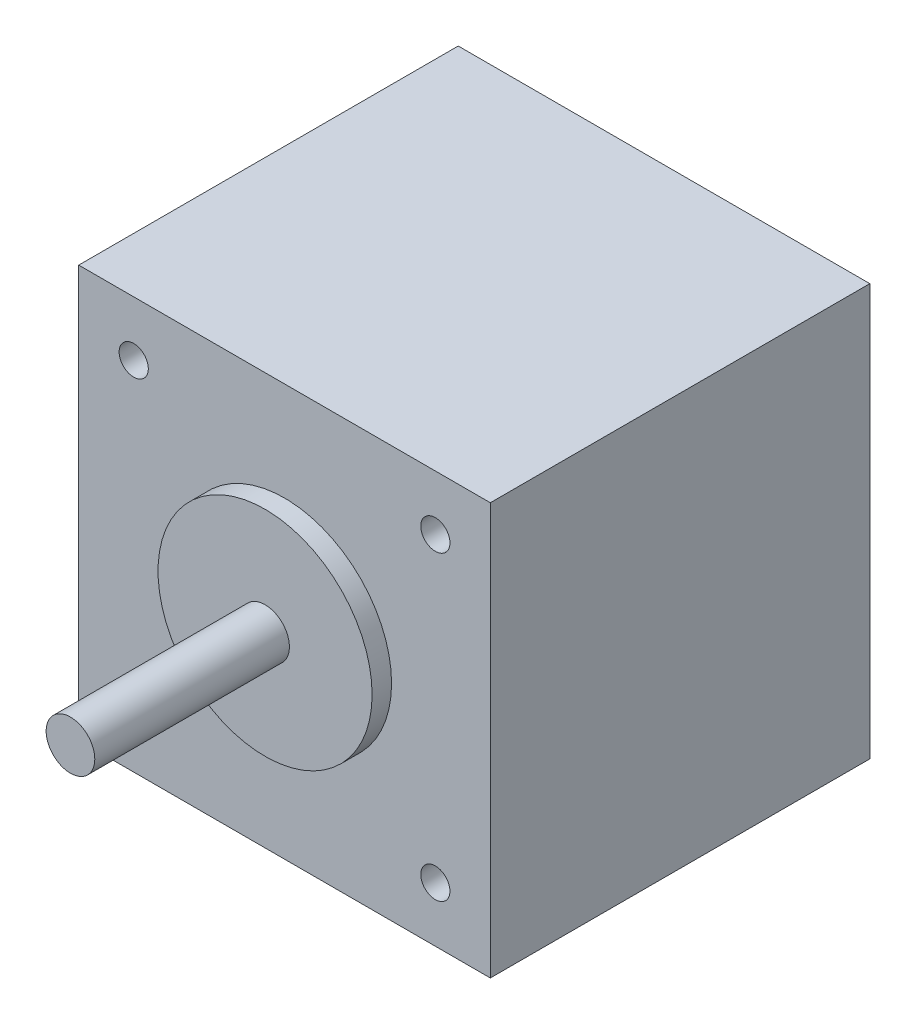
ISO-10303-21;
HEADER;
FILE_DESCRIPTION(('STEP AP214'),'2;1');
FILE_NAME('part.step','',(''),(''),'','','');
FILE_SCHEMA(('AUTOMOTIVE_DESIGN { 1 0 10303 214 1 1 1 1 }'));
ENDSEC;
DATA;
#1=APPLICATION_CONTEXT('core data for automotive mechanical design processes');
#2=APPLICATION_PROTOCOL_DEFINITION('international standard','automotive_design',2000,#1);
#3=PRODUCT_CONTEXT('',#1,'mechanical');
#4=PRODUCT('Part','Part','',(#3));
#5=PRODUCT_RELATED_PRODUCT_CATEGORY('part','',(#4));
#6=PRODUCT_DEFINITION_FORMATION('','',#4);
#7=PRODUCT_DEFINITION_CONTEXT('part definition',#1,'design');
#8=PRODUCT_DEFINITION('design','',#6,#7);
#9=PRODUCT_DEFINITION_SHAPE('','',#8);
#10=(LENGTH_UNIT() NAMED_UNIT(*) SI_UNIT(.MILLI.,.METRE.));
#11=(NAMED_UNIT(*) PLANE_ANGLE_UNIT() SI_UNIT($,.RADIAN.));
#12=(NAMED_UNIT(*) SI_UNIT($,.STERADIAN.) SOLID_ANGLE_UNIT());
#13=UNCERTAINTY_MEASURE_WITH_UNIT(LENGTH_MEASURE(1.E-05),#10,'distance_accuracy_value','');
#14=(GEOMETRIC_REPRESENTATION_CONTEXT(3) GLOBAL_UNCERTAINTY_ASSIGNED_CONTEXT((#13)) GLOBAL_UNIT_ASSIGNED_CONTEXT((#10,
#11,#12)) REPRESENTATION_CONTEXT('',''));
#15=CARTESIAN_POINT('',(0.,0.,0.));
#16=DIRECTION('',(0.,0.,1.));
#17=DIRECTION('',(1.,0.,0.));
#18=AXIS2_PLACEMENT_3D('',#15,#16,#17);
#19=CARTESIAN_POINT('',(21.15,-21.15,39.));
#20=DIRECTION('',(-1.,0.,0.));
#21=DIRECTION('',(0.,0.,1.));
#22=AXIS2_PLACEMENT_3D('',#19,#20,#21);
#23=PLANE('',#22);
#24=DIRECTION('',(0.,1.,0.));
#25=VECTOR('',#24,1.);
#26=CARTESIAN_POINT('',(21.15,-21.15,0.));
#27=LINE('',#26,#25);
#28=CARTESIAN_POINT('',(21.15,-21.15,0.));
#29=VERTEX_POINT('',#28);
#30=CARTESIAN_POINT('',(21.15,21.15,0.));
#31=VERTEX_POINT('',#30);
#32=EDGE_CURVE('E110',#29,#31,#27,.T.);
#33=ORIENTED_EDGE('',*,*,#32,.T.);
#34=DIRECTION('',(0.,0.,-1.));
#35=VECTOR('',#34,1.);
#36=CARTESIAN_POINT('',(21.15,21.15,39.));
#37=LINE('',#36,#35);
#38=CARTESIAN_POINT('',(21.15,21.15,39.));
#39=VERTEX_POINT('',#38);
#40=EDGE_CURVE('E41',#39,#31,#37,.T.);
#41=ORIENTED_EDGE('',*,*,#40,.F.);
#42=DIRECTION('',(0.,1.,0.));
#43=VECTOR('',#42,1.);
#44=CARTESIAN_POINT('',(21.15,-21.15,39.));
#45=LINE('',#44,#43);
#46=CARTESIAN_POINT('',(21.15,-21.15,39.));
#47=VERTEX_POINT('',#46);
#48=EDGE_CURVE('E93',#47,#39,#45,.T.);
#49=ORIENTED_EDGE('',*,*,#48,.F.);
#50=DIRECTION('',(0.,0.,-1.));
#51=VECTOR('',#50,1.);
#52=CARTESIAN_POINT('',(21.15,-21.15,39.));
#53=LINE('',#52,#51);
#54=EDGE_CURVE('E106',#47,#29,#53,.T.);
#55=ORIENTED_EDGE('',*,*,#54,.T.);
#56=EDGE_LOOP('',(#33,#41,#49,#55));
#57=FACE_BOUND('',#56,.T.);
#58=ADVANCED_FACE('F38',(#57),#23,.F.);
#59=CARTESIAN_POINT('',(-21.15,21.15,39.));
#60=DIRECTION('',(0.,-1.,0.));
#61=DIRECTION('',(0.,0.,-1.));
#62=AXIS2_PLACEMENT_3D('',#59,#60,#61);
#63=PLANE('',#62);
#64=DIRECTION('',(-1.,0.,0.));
#65=VECTOR('',#64,1.);
#66=CARTESIAN_POINT('',(-21.15,21.15,0.));
#67=LINE('',#66,#65);
#68=CARTESIAN_POINT('',(-21.15,21.15,0.));
#69=VERTEX_POINT('',#68);
#70=EDGE_CURVE('E98',#31,#69,#67,.T.);
#71=ORIENTED_EDGE('',*,*,#70,.T.);
#72=DIRECTION('',(0.,0.,-1.));
#73=VECTOR('',#72,1.);
#74=CARTESIAN_POINT('',(-21.15,21.15,39.));
#75=LINE('',#74,#73);
#76=CARTESIAN_POINT('',(-21.15,21.15,39.));
#77=VERTEX_POINT('',#76);
#78=EDGE_CURVE('E96',#77,#69,#75,.T.);
#79=ORIENTED_EDGE('',*,*,#78,.F.);
#80=DIRECTION('',(-1.,0.,0.));
#81=VECTOR('',#80,1.);
#82=CARTESIAN_POINT('',(-21.15,21.15,39.));
#83=LINE('',#82,#81);
#84=EDGE_CURVE('E88',#39,#77,#83,.T.);
#85=ORIENTED_EDGE('',*,*,#84,.F.);
#86=ORIENTED_EDGE('',*,*,#40,.T.);
#87=EDGE_LOOP('',(#71,#79,#85,#86));
#88=FACE_BOUND('',#87,.T.);
#89=ADVANCED_FACE('F97',(#88),#63,.F.);
#90=CARTESIAN_POINT('',(-21.15,-21.15,39.));
#91=DIRECTION('',(1.,0.,0.));
#92=DIRECTION('',(0.,0.,-1.));
#93=AXIS2_PLACEMENT_3D('',#90,#91,#92);
#94=PLANE('',#93);
#95=DIRECTION('',(0.,-1.,0.));
#96=VECTOR('',#95,1.);
#97=CARTESIAN_POINT('',(-21.15,-21.15,0.));
#98=LINE('',#97,#96);
#99=CARTESIAN_POINT('',(-21.15,-21.15,0.));
#100=VERTEX_POINT('',#99);
#101=EDGE_CURVE('E74',#69,#100,#98,.T.);
#102=ORIENTED_EDGE('',*,*,#101,.T.);
#103=DIRECTION('',(0.,0.,-1.));
#104=VECTOR('',#103,1.);
#105=CARTESIAN_POINT('',(-21.15,-21.15,39.));
#106=LINE('',#105,#104);
#107=CARTESIAN_POINT('',(-21.15,-21.15,39.));
#108=VERTEX_POINT('',#107);
#109=EDGE_CURVE('E99',#108,#100,#106,.T.);
#110=ORIENTED_EDGE('',*,*,#109,.F.);
#111=DIRECTION('',(0.,-1.,0.));
#112=VECTOR('',#111,1.);
#113=CARTESIAN_POINT('',(-21.15,-21.15,39.));
#114=LINE('',#113,#112);
#115=EDGE_CURVE('E91',#77,#108,#114,.T.);
#116=ORIENTED_EDGE('',*,*,#115,.F.);
#117=ORIENTED_EDGE('',*,*,#78,.T.);
#118=EDGE_LOOP('',(#102,#110,#116,#117));
#119=FACE_BOUND('',#118,.T.);
#120=ADVANCED_FACE('F100',(#119),#94,.F.);
#121=CARTESIAN_POINT('',(-21.15,-21.15,39.));
#122=DIRECTION('',(0.,1.,0.));
#123=DIRECTION('',(0.,0.,1.));
#124=AXIS2_PLACEMENT_3D('',#121,#122,#123);
#125=PLANE('',#124);
#126=DIRECTION('',(1.,0.,0.));
#127=VECTOR('',#126,1.);
#128=CARTESIAN_POINT('',(-21.15,-21.15,0.));
#129=LINE('',#128,#127);
#130=EDGE_CURVE('E80',#100,#29,#129,.T.);
#131=ORIENTED_EDGE('',*,*,#130,.T.);
#132=ORIENTED_EDGE('',*,*,#54,.F.);
#133=DIRECTION('',(1.,0.,0.));
#134=VECTOR('',#133,1.);
#135=CARTESIAN_POINT('',(-21.15,-21.15,39.));
#136=LINE('',#135,#134);
#137=EDGE_CURVE('E57',#108,#47,#136,.T.);
#138=ORIENTED_EDGE('',*,*,#137,.F.);
#139=ORIENTED_EDGE('',*,*,#109,.T.);
#140=EDGE_LOOP('',(#131,#132,#138,#139));
#141=FACE_BOUND('',#140,.T.);
#142=ADVANCED_FACE('F123',(#141),#125,.F.);
#143=CARTESIAN_POINT('',(0.,0.,39.));
#144=DIRECTION('',(0.,0.,-1.));
#145=DIRECTION('',(-1.,0.,0.));
#146=AXIS2_PLACEMENT_3D('',#143,#144,#145);
#147=PLANE('',#146);
#148=CARTESIAN_POINT('',(-15.5,-15.5,39.));
#149=DIRECTION('',(0.,0.,1.));
#150=DIRECTION('',(1.,0.,0.));
#151=AXIS2_PLACEMENT_3D('',#148,#149,#150);
#152=CIRCLE('',#151,1.5);
#153=CARTESIAN_POINT('',(-14.,-15.5,39.));
#154=VERTEX_POINT('',#153);
#155=EDGE_CURVE('E148',#154,#154,#152,.T.);
#156=ORIENTED_EDGE('',*,*,#155,.F.);
#157=EDGE_LOOP('',(#156));
#158=FACE_BOUND('',#157,.T.);
#159=CARTESIAN_POINT('',(15.5,-15.5,39.));
#160=DIRECTION('',(0.,0.,1.));
#161=DIRECTION('',(1.,0.,0.));
#162=AXIS2_PLACEMENT_3D('',#159,#160,#161);
#163=CIRCLE('',#162,1.5);
#164=CARTESIAN_POINT('',(17.,-15.5,39.));
#165=VERTEX_POINT('',#164);
#166=EDGE_CURVE('E154',#165,#165,#163,.T.);
#167=ORIENTED_EDGE('',*,*,#166,.F.);
#168=EDGE_LOOP('',(#167));
#169=FACE_BOUND('',#168,.T.);
#170=CARTESIAN_POINT('',(15.5,15.5,39.));
#171=DIRECTION('',(0.,0.,1.));
#172=DIRECTION('',(1.,0.,0.));
#173=AXIS2_PLACEMENT_3D('',#170,#171,#172);
#174=CIRCLE('',#173,1.5);
#175=CARTESIAN_POINT('',(17.,15.5,39.));
#176=VERTEX_POINT('',#175);
#177=EDGE_CURVE('E161',#176,#176,#174,.T.);
#178=ORIENTED_EDGE('',*,*,#177,.F.);
#179=EDGE_LOOP('',(#178));
#180=FACE_BOUND('',#179,.T.);
#181=CARTESIAN_POINT('',(-15.5,15.5,39.));
#182=DIRECTION('',(0.,0.,1.));
#183=DIRECTION('',(1.,0.,0.));
#184=AXIS2_PLACEMENT_3D('',#181,#182,#183);
#185=CIRCLE('',#184,1.5);
#186=CARTESIAN_POINT('',(-14.,15.5,39.));
#187=VERTEX_POINT('',#186);
#188=EDGE_CURVE('E142',#187,#187,#185,.T.);
#189=ORIENTED_EDGE('',*,*,#188,.F.);
#190=EDGE_LOOP('',(#189));
#191=FACE_BOUND('',#190,.T.);
#192=CARTESIAN_POINT('',(0.,0.,39.));
#193=DIRECTION('',(0.,0.,1.));
#194=DIRECTION('',(1.,0.,0.));
#195=AXIS2_PLACEMENT_3D('',#192,#193,#194);
#196=CIRCLE('',#195,11.);
#197=CARTESIAN_POINT('',(11.,0.,39.));
#198=VERTEX_POINT('',#197);
#199=EDGE_CURVE('E48',#198,#198,#196,.T.);
#200=ORIENTED_EDGE('',*,*,#199,.F.);
#201=EDGE_LOOP('',(#200));
#202=FACE_BOUND('',#201,.T.);
#203=ORIENTED_EDGE('',*,*,#48,.T.);
#204=ORIENTED_EDGE('',*,*,#84,.T.);
#205=ORIENTED_EDGE('',*,*,#115,.T.);
#206=ORIENTED_EDGE('',*,*,#137,.T.);
#207=EDGE_LOOP('',(#203,#204,#205,#206));
#208=FACE_BOUND('',#207,.T.);
#209=ADVANCED_FACE('F89',(#158,#169,#180,#191,#202,#208),#147,.F.);
#210=CARTESIAN_POINT('',(0.,0.,0.));
#211=DIRECTION('',(0.,0.,-1.));
#212=DIRECTION('',(-1.,0.,0.));
#213=AXIS2_PLACEMENT_3D('',#210,#211,#212);
#214=PLANE('',#213);
#215=ORIENTED_EDGE('',*,*,#32,.F.);
#216=ORIENTED_EDGE('',*,*,#130,.F.);
#217=ORIENTED_EDGE('',*,*,#101,.F.);
#218=ORIENTED_EDGE('',*,*,#70,.F.);
#219=EDGE_LOOP('',(#215,#216,#217,#218));
#220=FACE_BOUND('',#219,.T.);
#221=ADVANCED_FACE('F126',(#220),#214,.T.);
#222=CARTESIAN_POINT('',(0.,0.,41.));
#223=DIRECTION('',(0.,0.,-1.));
#224=DIRECTION('',(-1.,0.,0.));
#225=AXIS2_PLACEMENT_3D('',#222,#223,#224);
#226=CYLINDRICAL_SURFACE('',#225,11.);
#227=CARTESIAN_POINT('',(0.,0.,41.));
#228=DIRECTION('',(0.,0.,1.));
#229=DIRECTION('',(1.,0.,0.));
#230=AXIS2_PLACEMENT_3D('',#227,#228,#229);
#231=CIRCLE('',#230,11.);
#232=CARTESIAN_POINT('',(11.,0.,41.));
#233=VERTEX_POINT('',#232);
#234=EDGE_CURVE('E114',#233,#233,#231,.T.);
#235=ORIENTED_EDGE('',*,*,#234,.F.);
#236=EDGE_LOOP('',(#235));
#237=FACE_BOUND('',#236,.T.);
#238=ORIENTED_EDGE('',*,*,#199,.T.);
#239=EDGE_LOOP('',(#238));
#240=FACE_BOUND('',#239,.T.);
#241=ADVANCED_FACE('F184',(#237,#240),#226,.T.);
#242=CARTESIAN_POINT('',(0.,0.,41.));
#243=DIRECTION('',(0.,0.,1.));
#244=DIRECTION('',(1.,0.,0.));
#245=AXIS2_PLACEMENT_3D('',#242,#243,#244);
#246=PLANE('',#245);
#247=CARTESIAN_POINT('',(0.,0.,41.));
#248=DIRECTION('',(0.,0.,1.));
#249=DIRECTION('',(1.,0.,0.));
#250=AXIS2_PLACEMENT_3D('',#247,#248,#249);
#251=CIRCLE('',#250,2.5);
#252=CARTESIAN_POINT('',(2.5,0.,41.));
#253=VERTEX_POINT('',#252);
#254=EDGE_CURVE('E11',#253,#253,#251,.T.);
#255=ORIENTED_EDGE('',*,*,#254,.F.);
#256=EDGE_LOOP('',(#255));
#257=FACE_BOUND('',#256,.T.);
#258=ORIENTED_EDGE('',*,*,#234,.T.);
#259=EDGE_LOOP('',(#258));
#260=FACE_BOUND('',#259,.T.);
#261=ADVANCED_FACE('F186',(#257,#260),#246,.T.);
#262=CARTESIAN_POINT('',(0.,0.,61.));
#263=DIRECTION('',(0.,0.,-1.));
#264=DIRECTION('',(-1.,0.,0.));
#265=AXIS2_PLACEMENT_3D('',#262,#263,#264);
#266=CYLINDRICAL_SURFACE('',#265,2.5);
#267=CARTESIAN_POINT('',(0.,0.,61.));
#268=DIRECTION('',(0.,0.,1.));
#269=DIRECTION('',(1.,0.,0.));
#270=AXIS2_PLACEMENT_3D('',#267,#268,#269);
#271=CIRCLE('',#270,2.5);
#272=CARTESIAN_POINT('',(2.5,0.,61.));
#273=VERTEX_POINT('',#272);
#274=EDGE_CURVE('E137',#273,#273,#271,.T.);
#275=ORIENTED_EDGE('',*,*,#274,.F.);
#276=EDGE_LOOP('',(#275));
#277=FACE_BOUND('',#276,.T.);
#278=ORIENTED_EDGE('',*,*,#254,.T.);
#279=EDGE_LOOP('',(#278));
#280=FACE_BOUND('',#279,.T.);
#281=ADVANCED_FACE('F193',(#277,#280),#266,.T.);
#282=CARTESIAN_POINT('',(0.,0.,61.));
#283=DIRECTION('',(0.,0.,1.));
#284=DIRECTION('',(1.,0.,0.));
#285=AXIS2_PLACEMENT_3D('',#282,#283,#284);
#286=PLANE('',#285);
#287=ORIENTED_EDGE('',*,*,#274,.T.);
#288=EDGE_LOOP('',(#287));
#289=FACE_BOUND('',#288,.T.);
#290=ADVANCED_FACE('F232',(#289),#286,.T.);
#291=CARTESIAN_POINT('',(-15.5,15.5,35.));
#292=DIRECTION('',(0.,0.,1.));
#293=DIRECTION('',(1.,0.,0.));
#294=AXIS2_PLACEMENT_3D('',#291,#292,#293);
#295=CYLINDRICAL_SURFACE('',#294,1.5);
#296=CARTESIAN_POINT('',(-15.5,15.5,35.));
#297=DIRECTION('',(0.,0.,1.));
#298=DIRECTION('',(1.,0.,0.));
#299=AXIS2_PLACEMENT_3D('',#296,#297,#298);
#300=CIRCLE('',#299,1.5);
#301=CARTESIAN_POINT('',(-14.,15.5,35.));
#302=VERTEX_POINT('',#301);
#303=EDGE_CURVE('E141',#302,#302,#300,.T.);
#304=ORIENTED_EDGE('',*,*,#303,.F.);
#305=EDGE_LOOP('',(#304));
#306=FACE_BOUND('',#305,.T.);
#307=ORIENTED_EDGE('',*,*,#188,.T.);
#308=EDGE_LOOP('',(#307));
#309=FACE_BOUND('',#308,.T.);
#310=ADVANCED_FACE('F245',(#306,#309),#295,.F.);
#311=CARTESIAN_POINT('',(-15.5,15.5,35.));
#312=DIRECTION('',(0.,0.,1.));
#313=DIRECTION('',(1.,0.,0.));
#314=AXIS2_PLACEMENT_3D('',#311,#312,#313);
#315=PLANE('',#314);
#316=ORIENTED_EDGE('',*,*,#303,.T.);
#317=EDGE_LOOP('',(#316));
#318=FACE_BOUND('',#317,.T.);
#319=ADVANCED_FACE('F172',(#318),#315,.T.);
#320=CARTESIAN_POINT('',(15.5,15.5,35.));
#321=DIRECTION('',(0.,0.,1.));
#322=DIRECTION('',(1.,0.,0.));
#323=AXIS2_PLACEMENT_3D('',#320,#321,#322);
#324=CYLINDRICAL_SURFACE('',#323,1.5);
#325=CARTESIAN_POINT('',(15.5,15.5,35.));
#326=DIRECTION('',(0.,0.,1.));
#327=DIRECTION('',(1.,0.,0.));
#328=AXIS2_PLACEMENT_3D('',#325,#326,#327);
#329=CIRCLE('',#328,1.5);
#330=CARTESIAN_POINT('',(17.,15.5,35.));
#331=VERTEX_POINT('',#330);
#332=EDGE_CURVE('E145',#331,#331,#329,.T.);
#333=ORIENTED_EDGE('',*,*,#332,.F.);
#334=EDGE_LOOP('',(#333));
#335=FACE_BOUND('',#334,.T.);
#336=ORIENTED_EDGE('',*,*,#177,.T.);
#337=EDGE_LOOP('',(#336));
#338=FACE_BOUND('',#337,.T.);
#339=ADVANCED_FACE('F169',(#335,#338),#324,.F.);
#340=CARTESIAN_POINT('',(15.5,15.5,35.));
#341=DIRECTION('',(0.,0.,1.));
#342=DIRECTION('',(1.,0.,0.));
#343=AXIS2_PLACEMENT_3D('',#340,#341,#342);
#344=PLANE('',#343);
#345=ORIENTED_EDGE('',*,*,#332,.T.);
#346=EDGE_LOOP('',(#345));
#347=FACE_BOUND('',#346,.T.);
#348=ADVANCED_FACE('F167',(#347),#344,.T.);
#349=CARTESIAN_POINT('',(15.5,-15.5,35.));
#350=DIRECTION('',(0.,0.,1.));
#351=DIRECTION('',(1.,0.,0.));
#352=AXIS2_PLACEMENT_3D('',#349,#350,#351);
#353=CYLINDRICAL_SURFACE('',#352,1.5);
#354=CARTESIAN_POINT('',(15.5,-15.5,35.));
#355=DIRECTION('',(0.,0.,1.));
#356=DIRECTION('',(1.,0.,0.));
#357=AXIS2_PLACEMENT_3D('',#354,#355,#356);
#358=CIRCLE('',#357,1.5);
#359=CARTESIAN_POINT('',(17.,-15.5,35.));
#360=VERTEX_POINT('',#359);
#361=EDGE_CURVE('E158',#360,#360,#358,.T.);
#362=ORIENTED_EDGE('',*,*,#361,.F.);
#363=EDGE_LOOP('',(#362));
#364=FACE_BOUND('',#363,.T.);
#365=ORIENTED_EDGE('',*,*,#166,.T.);
#366=EDGE_LOOP('',(#365));
#367=FACE_BOUND('',#366,.T.);
#368=ADVANCED_FACE('F271',(#364,#367),#353,.F.);
#369=CARTESIAN_POINT('',(15.5,-15.5,35.));
#370=DIRECTION('',(0.,0.,1.));
#371=DIRECTION('',(1.,0.,0.));
#372=AXIS2_PLACEMENT_3D('',#369,#370,#371);
#373=PLANE('',#372);
#374=ORIENTED_EDGE('',*,*,#361,.T.);
#375=EDGE_LOOP('',(#374));
#376=FACE_BOUND('',#375,.T.);
#377=ADVANCED_FACE('F278',(#376),#373,.T.);
#378=CARTESIAN_POINT('',(-15.5,-15.5,35.));
#379=DIRECTION('',(0.,0.,1.));
#380=DIRECTION('',(1.,0.,0.));
#381=AXIS2_PLACEMENT_3D('',#378,#379,#380);
#382=CYLINDRICAL_SURFACE('',#381,1.5);
#383=CARTESIAN_POINT('',(-15.5,-15.5,35.));
#384=DIRECTION('',(0.,0.,1.));
#385=DIRECTION('',(1.,0.,0.));
#386=AXIS2_PLACEMENT_3D('',#383,#384,#385);
#387=CIRCLE('',#386,1.5);
#388=CARTESIAN_POINT('',(-14.,-15.5,35.));
#389=VERTEX_POINT('',#388);
#390=EDGE_CURVE('E151',#389,#389,#387,.T.);
#391=ORIENTED_EDGE('',*,*,#390,.F.);
#392=EDGE_LOOP('',(#391));
#393=FACE_BOUND('',#392,.T.);
#394=ORIENTED_EDGE('',*,*,#155,.T.);
#395=EDGE_LOOP('',(#394));
#396=FACE_BOUND('',#395,.T.);
#397=ADVANCED_FACE('F285',(#393,#396),#382,.F.);
#398=CARTESIAN_POINT('',(-15.5,-15.5,35.));
#399=DIRECTION('',(0.,0.,1.));
#400=DIRECTION('',(1.,0.,0.));
#401=AXIS2_PLACEMENT_3D('',#398,#399,#400);
#402=PLANE('',#401);
#403=ORIENTED_EDGE('',*,*,#390,.T.);
#404=EDGE_LOOP('',(#403));
#405=FACE_BOUND('',#404,.T.);
#406=ADVANCED_FACE('F293',(#405),#402,.T.);
#407=CLOSED_SHELL('',(#58,#89,#120,#142,#209,#221,#241,#261,#281,#290,#310,#319,#339,#348,#368,
#377,#397,#406));
#408=MANIFOLD_SOLID_BREP('B2',#407);
#409=ADVANCED_BREP_SHAPE_REPRESENTATION('',(#18,#408),#14);
#410=SHAPE_DEFINITION_REPRESENTATION(#9,#409);
ENDSEC;
END-ISO-10303-21;
